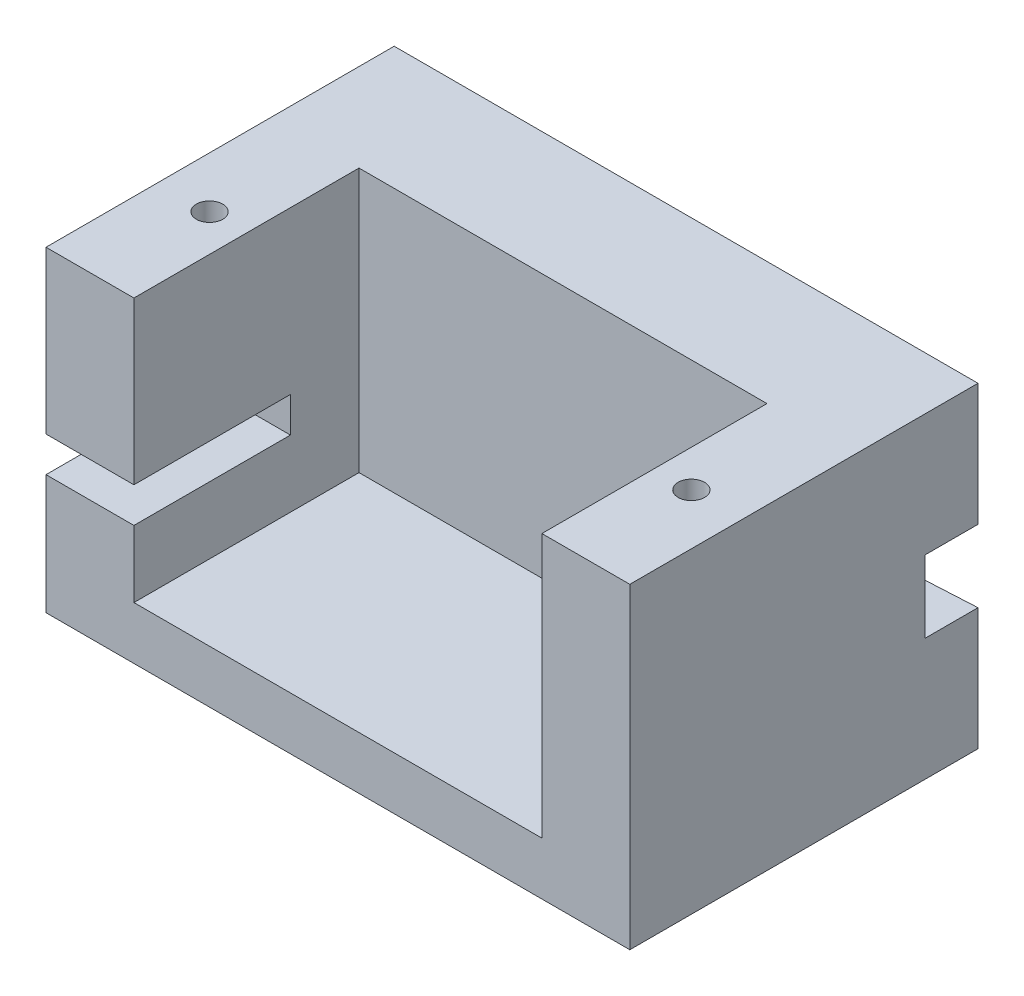
ISO-10303-21;
HEADER;
FILE_DESCRIPTION(('STEP AP214'),'2;1');
FILE_NAME('part.step','',(''),(''),'','','');
FILE_SCHEMA(('AUTOMOTIVE_DESIGN { 1 0 10303 214 1 1 1 1 }'));
ENDSEC;
DATA;
#1=APPLICATION_CONTEXT('core data for automotive mechanical design processes');
#2=APPLICATION_PROTOCOL_DEFINITION('international standard','automotive_design',2000,#1);
#3=PRODUCT_CONTEXT('',#1,'mechanical');
#4=PRODUCT('Part','Part','',(#3));
#5=PRODUCT_RELATED_PRODUCT_CATEGORY('part','',(#4));
#6=PRODUCT_DEFINITION_FORMATION('','',#4);
#7=PRODUCT_DEFINITION_CONTEXT('part definition',#1,'design');
#8=PRODUCT_DEFINITION('design','',#6,#7);
#9=PRODUCT_DEFINITION_SHAPE('','',#8);
#10=(LENGTH_UNIT() NAMED_UNIT(*) SI_UNIT(.MILLI.,.METRE.));
#11=(NAMED_UNIT(*) PLANE_ANGLE_UNIT() SI_UNIT($,.RADIAN.));
#12=(NAMED_UNIT(*) SI_UNIT($,.STERADIAN.) SOLID_ANGLE_UNIT());
#13=UNCERTAINTY_MEASURE_WITH_UNIT(LENGTH_MEASURE(1.E-05),#10,'distance_accuracy_value','');
#14=(GEOMETRIC_REPRESENTATION_CONTEXT(3) GLOBAL_UNCERTAINTY_ASSIGNED_CONTEXT((#13)) GLOBAL_UNIT_ASSIGNED_CONTEXT((#10,
#11,#12)) REPRESENTATION_CONTEXT('',''));
#15=CARTESIAN_POINT('',(0.,0.,0.));
#16=DIRECTION('',(0.,0.,1.));
#17=DIRECTION('',(1.,0.,0.));
#18=AXIS2_PLACEMENT_3D('',#15,#16,#17);
#19=CARTESIAN_POINT('',(27.9,14.7,0.3));
#20=DIRECTION('',(0.,0.,-1.));
#21=DIRECTION('',(0.,1.,0.));
#22=AXIS2_PLACEMENT_3D('',#19,#20,#21);
#23=PLANE('',#22);
#24=DIRECTION('',(0.,-1.,0.));
#25=VECTOR('',#24,1.);
#26=CARTESIAN_POINT('',(-0.3,55.275054314054,0.3));
#27=LINE('',#26,#25);
#28=CARTESIAN_POINT('',(-0.300000000000002,3.5,0.3));
#29=VERTEX_POINT('',#28);
#30=CARTESIAN_POINT('',(-0.3,-0.3,0.300000000000004));
#31=VERTEX_POINT('',#30);
#32=EDGE_CURVE('E183',#29,#31,#27,.T.);
#33=ORIENTED_EDGE('',*,*,#32,.F.);
#34=DIRECTION('',(-1.,0.,0.));
#35=VECTOR('',#34,1.);
#36=CARTESIAN_POINT('',(27.901,3.5,0.299999999999999));
#37=LINE('',#36,#35);
#38=CARTESIAN_POINT('',(-5.3,3.5,0.300000000000003));
#39=VERTEX_POINT('',#38);
#40=EDGE_CURVE('E191',#29,#39,#37,.T.);
#41=ORIENTED_EDGE('',*,*,#40,.T.);
#42=DIRECTION('',(0.,-1.,0.));
#43=VECTOR('',#42,1.);
#44=CARTESIAN_POINT('',(-5.3,14.7,0.300000000000001));
#45=LINE('',#44,#43);
#46=CARTESIAN_POINT('',(-5.3,-3.3,0.300000000000001));
#47=VERTEX_POINT('',#46);
#48=EDGE_CURVE('E423',#39,#47,#45,.T.);
#49=ORIENTED_EDGE('',*,*,#48,.T.);
#50=DIRECTION('',(-1.,0.,0.));
#51=VECTOR('',#50,1.);
#52=CARTESIAN_POINT('',(27.9,-3.3,0.300000000000005));
#53=LINE('',#52,#51);
#54=CARTESIAN_POINT('',(27.9,-3.3,0.300000000000005));
#55=VERTEX_POINT('',#54);
#56=EDGE_CURVE('E312',#55,#47,#53,.T.);
#57=ORIENTED_EDGE('',*,*,#56,.F.);
#58=DIRECTION('',(0.,-1.,0.));
#59=VECTOR('',#58,1.);
#60=CARTESIAN_POINT('',(27.9,14.7,0.3));
#61=LINE('',#60,#59);
#62=CARTESIAN_POINT('',(27.9,14.7,0.3));
#63=VERTEX_POINT('',#62);
#64=EDGE_CURVE('E418',#63,#55,#61,.T.);
#65=ORIENTED_EDGE('',*,*,#64,.F.);
#66=DIRECTION('',(-1.,0.,0.));
#67=VECTOR('',#66,1.);
#68=CARTESIAN_POINT('',(27.9,14.7,0.3));
#69=LINE('',#68,#67);
#70=CARTESIAN_POINT('',(22.9,14.7,0.3));
#71=VERTEX_POINT('',#70);
#72=EDGE_CURVE('E412',#63,#71,#69,.T.);
#73=ORIENTED_EDGE('',*,*,#72,.T.);
#74=DIRECTION('',(0.,-1.,0.));
#75=VECTOR('',#74,1.);
#76=CARTESIAN_POINT('',(22.9,55.275054314054,0.3));
#77=LINE('',#76,#75);
#78=CARTESIAN_POINT('',(22.9,-0.3,0.300000000000004));
#79=VERTEX_POINT('',#78);
#80=EDGE_CURVE('E214',#71,#79,#77,.T.);
#81=ORIENTED_EDGE('',*,*,#80,.T.);
#82=DIRECTION('',(-1.,0.,0.));
#83=VECTOR('',#82,1.);
#84=CARTESIAN_POINT('',(22.9,-0.3,0.3));
#85=LINE('',#84,#83);
#86=EDGE_CURVE('E199',#79,#31,#85,.T.);
#87=ORIENTED_EDGE('',*,*,#86,.T.);
#88=EDGE_LOOP('',(#33,#41,#49,#57,#65,#73,#81,#87));
#89=FACE_BOUND('',#88,.T.);
#90=ADVANCED_FACE('F38',(#89),#23,.F.);
#91=CARTESIAN_POINT('',(0.,0.,-19.5));
#92=DIRECTION('',(0.,0.,-1.));
#93=DIRECTION('',(-1.,0.,0.));
#94=AXIS2_PLACEMENT_3D('',#91,#92,#93);
#95=PLANE('',#94);
#96=DIRECTION('',(-0.998711997828753,0.0507380073800748,0.));
#97=VECTOR('',#96,1.);
#98=CARTESIAN_POINT('',(-1.89708740221758,3.475,-19.5));
#99=LINE('',#98,#97);
#100=CARTESIAN_POINT('',(8.9289506542461,2.925,-19.5));
#101=VERTEX_POINT('',#100);
#102=CARTESIAN_POINT('',(-5.3,3.64787967389538,-19.5));
#103=VERTEX_POINT('',#102);
#104=EDGE_CURVE('E353',#101,#103,#99,.T.);
#105=ORIENTED_EDGE('',*,*,#104,.F.);
#106=CARTESIAN_POINT('',(11.3,5.7,-19.5));
#107=DIRECTION('',(0.,0.,-1.));
#108=DIRECTION('',(-1.,0.,0.));
#109=AXIS2_PLACEMENT_3D('',#106,#107,#108);
#110=CIRCLE('',#109,3.65);
#111=CARTESIAN_POINT('',(13.6710493457539,2.925,-19.5));
#112=VERTEX_POINT('',#111);
#113=EDGE_CURVE('E356',#112,#101,#110,.T.);
#114=ORIENTED_EDGE('',*,*,#113,.F.);
#115=DIRECTION('',(-0.998711997828753,-0.0507380073800734,0.));
#116=VECTOR('',#115,1.);
#117=CARTESIAN_POINT('',(13.6710493457539,2.925,-19.5));
#118=LINE('',#117,#116);
#119=CARTESIAN_POINT('',(27.9,3.64787967389537,-19.5));
#120=VERTEX_POINT('',#119);
#121=EDGE_CURVE('E360',#120,#112,#118,.T.);
#122=ORIENTED_EDGE('',*,*,#121,.F.);
#123=DIRECTION('',(0.,-1.,0.));
#124=VECTOR('',#123,1.);
#125=CARTESIAN_POINT('',(27.9,14.7,-19.5));
#126=LINE('',#125,#124);
#127=CARTESIAN_POINT('',(27.9,-3.3,-19.5));
#128=VERTEX_POINT('',#127);
#129=EDGE_CURVE('E272',#120,#128,#126,.T.);
#130=ORIENTED_EDGE('',*,*,#129,.T.);
#131=DIRECTION('',(-1.,0.,0.));
#132=VECTOR('',#131,1.);
#133=CARTESIAN_POINT('',(27.9,-3.3,-19.5));
#134=LINE('',#133,#132);
#135=CARTESIAN_POINT('',(-5.3,-3.3,-19.5));
#136=VERTEX_POINT('',#135);
#137=EDGE_CURVE('E267',#128,#136,#134,.T.);
#138=ORIENTED_EDGE('',*,*,#137,.T.);
#139=DIRECTION('',(0.,1.,0.));
#140=VECTOR('',#139,1.);
#141=CARTESIAN_POINT('',(-5.3,-3.3,-19.5));
#142=LINE('',#141,#140);
#143=EDGE_CURVE('E266',#136,#103,#142,.T.);
#144=ORIENTED_EDGE('',*,*,#143,.T.);
#145=EDGE_LOOP('',(#105,#114,#122,#130,#138,#144));
#146=FACE_BOUND('',#145,.T.);
#147=ADVANCED_FACE('F319',(#146),#95,.T.);
#148=CARTESIAN_POINT('',(27.9,55.275054314054,-17.5));
#149=DIRECTION('',(1.,0.,0.));
#150=DIRECTION('',(0.,0.,-1.));
#151=AXIS2_PLACEMENT_3D('',#148,#149,#150);
#152=PLANE('',#151);
#153=ORIENTED_EDGE('',*,*,#64,.T.);
#154=DIRECTION('',(0.,0.,1.));
#155=VECTOR('',#154,1.);
#156=CARTESIAN_POINT('',(27.9,-3.3,-17.5));
#157=LINE('',#156,#155);
#158=EDGE_CURVE('E300',#128,#55,#157,.T.);
#159=ORIENTED_EDGE('',*,*,#158,.F.);
#160=ORIENTED_EDGE('',*,*,#129,.F.);
#161=DIRECTION('',(0.,0.,-1.));
#162=VECTOR('',#161,1.);
#163=CARTESIAN_POINT('',(27.9,3.64787967389537,-16.5));
#164=LINE('',#163,#162);
#165=CARTESIAN_POINT('',(27.9,3.64787967389537,-16.5));
#166=VERTEX_POINT('',#165);
#167=EDGE_CURVE('E337',#166,#120,#164,.T.);
#168=ORIENTED_EDGE('',*,*,#167,.F.);
#169=DIRECTION('',(0.,-1.,0.));
#170=VECTOR('',#169,1.);
#171=CARTESIAN_POINT('',(27.9,7.75212032610461,-16.5));
#172=LINE('',#171,#170);
#173=CARTESIAN_POINT('',(27.9,7.75212032610461,-16.5));
#174=VERTEX_POINT('',#173);
#175=EDGE_CURVE('E387',#174,#166,#172,.T.);
#176=ORIENTED_EDGE('',*,*,#175,.F.);
#177=DIRECTION('',(0.,0.,-1.));
#178=VECTOR('',#177,1.);
#179=CARTESIAN_POINT('',(27.9,7.75212032610461,-16.5));
#180=LINE('',#179,#178);
#181=CARTESIAN_POINT('',(27.9,7.75212032610461,-19.5));
#182=VERTEX_POINT('',#181);
#183=EDGE_CURVE('E332',#174,#182,#180,.T.);
#184=ORIENTED_EDGE('',*,*,#183,.T.);
#185=CARTESIAN_POINT('',(27.9,14.7,-19.5));
#186=VERTEX_POINT('',#185);
#187=EDGE_CURVE('E189',#186,#182,#126,.T.);
#188=ORIENTED_EDGE('',*,*,#187,.F.);
#189=DIRECTION('',(0.,0.,1.));
#190=VECTOR('',#189,1.);
#191=CARTESIAN_POINT('',(27.9,14.7,-17.5));
#192=LINE('',#191,#190);
#193=EDGE_CURVE('E238',#186,#63,#192,.T.);
#194=ORIENTED_EDGE('',*,*,#193,.T.);
#195=EDGE_LOOP('',(#153,#159,#160,#168,#176,#184,#188,#194));
#196=FACE_BOUND('',#195,.T.);
#197=ADVANCED_FACE('F445',(#196),#152,.T.);
#198=CARTESIAN_POINT('',(-5.3,55.275054314054,-17.5));
#199=DIRECTION('',(-1.,0.,0.));
#200=DIRECTION('',(0.,0.,1.));
#201=AXIS2_PLACEMENT_3D('',#198,#199,#200);
#202=PLANE('',#201);
#203=ORIENTED_EDGE('',*,*,#48,.F.);
#204=DIRECTION('',(0.,0.,1.));
#205=VECTOR('',#204,1.);
#206=CARTESIAN_POINT('',(-5.3,3.5,-8.6));
#207=LINE('',#206,#205);
#208=CARTESIAN_POINT('',(-5.3,3.5,-8.6));
#209=VERTEX_POINT('',#208);
#210=EDGE_CURVE('E56',#209,#39,#207,.T.);
#211=ORIENTED_EDGE('',*,*,#210,.F.);
#212=DIRECTION('',(0.,-1.,0.));
#213=VECTOR('',#212,1.);
#214=CARTESIAN_POINT('',(-5.3,5.5,-8.6));
#215=LINE('',#214,#213);
#216=CARTESIAN_POINT('',(-5.3,5.5,-8.6));
#217=VERTEX_POINT('',#216);
#218=EDGE_CURVE('E288',#217,#209,#215,.T.);
#219=ORIENTED_EDGE('',*,*,#218,.F.);
#220=DIRECTION('',(0.,0.,1.));
#221=VECTOR('',#220,1.);
#222=CARTESIAN_POINT('',(-5.3,5.5,-8.6));
#223=LINE('',#222,#221);
#224=CARTESIAN_POINT('',(-5.3,5.5,0.300000000000001));
#225=VERTEX_POINT('',#224);
#226=EDGE_CURVE('E281',#217,#225,#223,.T.);
#227=ORIENTED_EDGE('',*,*,#226,.T.);
#228=CARTESIAN_POINT('',(-5.3,14.7,0.300000000000001));
#229=VERTEX_POINT('',#228);
#230=EDGE_CURVE('E251',#229,#225,#45,.T.);
#231=ORIENTED_EDGE('',*,*,#230,.F.);
#232=DIRECTION('',(0.,0.,-1.));
#233=VECTOR('',#232,1.);
#234=CARTESIAN_POINT('',(-5.3,14.7,-17.5));
#235=LINE('',#234,#233);
#236=CARTESIAN_POINT('',(-5.3,14.7,-19.5));
#237=VERTEX_POINT('',#236);
#238=EDGE_CURVE('E216',#229,#237,#235,.T.);
#239=ORIENTED_EDGE('',*,*,#238,.T.);
#240=CARTESIAN_POINT('',(-5.3,7.75212032610462,-19.5));
#241=VERTEX_POINT('',#240);
#242=EDGE_CURVE('E249',#241,#237,#142,.T.);
#243=ORIENTED_EDGE('',*,*,#242,.F.);
#244=DIRECTION('',(0.,0.,-1.));
#245=VECTOR('',#244,1.);
#246=CARTESIAN_POINT('',(-5.3,7.75212032610462,-16.5));
#247=LINE('',#246,#245);
#248=CARTESIAN_POINT('',(-5.3,7.75212032610462,-16.5));
#249=VERTEX_POINT('',#248);
#250=EDGE_CURVE('E325',#249,#241,#247,.T.);
#251=ORIENTED_EDGE('',*,*,#250,.F.);
#252=DIRECTION('',(0.,1.,0.));
#253=VECTOR('',#252,1.);
#254=CARTESIAN_POINT('',(-5.3,7.75212032610462,-16.5));
#255=LINE('',#254,#253);
#256=CARTESIAN_POINT('',(-5.3,3.64787967389538,-16.5));
#257=VERTEX_POINT('',#256);
#258=EDGE_CURVE('E373',#257,#249,#255,.T.);
#259=ORIENTED_EDGE('',*,*,#258,.F.);
#260=DIRECTION('',(0.,0.,-1.));
#261=VECTOR('',#260,1.);
#262=CARTESIAN_POINT('',(-5.3,3.64787967389538,-16.5));
#263=LINE('',#262,#261);
#264=EDGE_CURVE('E316',#257,#103,#263,.T.);
#265=ORIENTED_EDGE('',*,*,#264,.T.);
#266=ORIENTED_EDGE('',*,*,#143,.F.);
#267=DIRECTION('',(0.,0.,-1.));
#268=VECTOR('',#267,1.);
#269=CARTESIAN_POINT('',(-5.3,-3.3,5.3));
#270=LINE('',#269,#268);
#271=EDGE_CURVE('E229',#47,#136,#270,.T.);
#272=ORIENTED_EDGE('',*,*,#271,.F.);
#273=EDGE_LOOP('',(#203,#211,#219,#227,#231,#239,#243,#251,#259,#265,#266,#272));
#274=FACE_BOUND('',#273,.T.);
#275=ADVANCED_FACE('F247',(#274),#202,.T.);
#276=CARTESIAN_POINT('',(22.9,55.275054314054,-12.5));
#277=DIRECTION('',(1.,0.,0.));
#278=DIRECTION('',(0.,0.,-1.));
#279=AXIS2_PLACEMENT_3D('',#276,#277,#278);
#280=PLANE('',#279);
#281=DIRECTION('',(0.,0.,1.));
#282=VECTOR('',#281,1.);
#283=CARTESIAN_POINT('',(22.9,14.7,-12.5));
#284=LINE('',#283,#282);
#285=CARTESIAN_POINT('',(22.9,14.7,-12.5));
#286=VERTEX_POINT('',#285);
#287=EDGE_CURVE('E234',#286,#71,#284,.T.);
#288=ORIENTED_EDGE('',*,*,#287,.F.);
#289=DIRECTION('',(0.,-1.,0.));
#290=VECTOR('',#289,1.);
#291=CARTESIAN_POINT('',(22.9,55.275054314054,-12.5));
#292=LINE('',#291,#290);
#293=CARTESIAN_POINT('',(22.9,-0.3,-12.5));
#294=VERTEX_POINT('',#293);
#295=EDGE_CURVE('E217',#286,#294,#292,.T.);
#296=ORIENTED_EDGE('',*,*,#295,.T.);
#297=DIRECTION('',(0.,0.,1.));
#298=VECTOR('',#297,1.);
#299=CARTESIAN_POINT('',(22.9,-0.3,-12.5));
#300=LINE('',#299,#298);
#301=EDGE_CURVE('E220',#294,#79,#300,.T.);
#302=ORIENTED_EDGE('',*,*,#301,.T.);
#303=ORIENTED_EDGE('',*,*,#80,.F.);
#304=EDGE_LOOP('',(#288,#296,#302,#303));
#305=FACE_BOUND('',#304,.T.);
#306=ADVANCED_FACE('F466',(#305),#280,.F.);
#307=CARTESIAN_POINT('',(22.9,55.275054314054,-12.5));
#308=DIRECTION('',(0.,0.,-1.));
#309=DIRECTION('',(-1.,0.,0.));
#310=AXIS2_PLACEMENT_3D('',#307,#308,#309);
#311=PLANE('',#310);
#312=DIRECTION('',(1.,0.,0.));
#313=VECTOR('',#312,1.);
#314=CARTESIAN_POINT('',(22.9,14.7,-12.5));
#315=LINE('',#314,#313);
#316=CARTESIAN_POINT('',(-0.3,14.7,-12.5));
#317=VERTEX_POINT('',#316);
#318=EDGE_CURVE('E11',#317,#286,#315,.T.);
#319=ORIENTED_EDGE('',*,*,#318,.F.);
#320=DIRECTION('',(0.,-1.,0.));
#321=VECTOR('',#320,1.);
#322=CARTESIAN_POINT('',(-0.3,55.275054314054,-12.5));
#323=LINE('',#322,#321);
#324=CARTESIAN_POINT('',(-0.3,-0.3,-12.5));
#325=VERTEX_POINT('',#324);
#326=EDGE_CURVE('E42',#317,#325,#323,.T.);
#327=ORIENTED_EDGE('',*,*,#326,.T.);
#328=DIRECTION('',(1.,0.,0.));
#329=VECTOR('',#328,1.);
#330=CARTESIAN_POINT('',(22.9,-0.3,-12.5));
#331=LINE('',#330,#329);
#332=EDGE_CURVE('E203',#325,#294,#331,.T.);
#333=ORIENTED_EDGE('',*,*,#332,.T.);
#334=ORIENTED_EDGE('',*,*,#295,.F.);
#335=EDGE_LOOP('',(#319,#327,#333,#334));
#336=FACE_BOUND('',#335,.T.);
#337=ADVANCED_FACE('F464',(#336),#311,.F.);
#338=CARTESIAN_POINT('',(-0.3,55.275054314054,-12.5));
#339=DIRECTION('',(-1.,0.,0.));
#340=DIRECTION('',(0.,0.,1.));
#341=AXIS2_PLACEMENT_3D('',#338,#339,#340);
#342=PLANE('',#341);
#343=DIRECTION('',(0.,0.,-1.));
#344=VECTOR('',#343,1.);
#345=CARTESIAN_POINT('',(-0.300000000000002,3.5,-8.6));
#346=LINE('',#345,#344);
#347=CARTESIAN_POINT('',(-0.3,3.5,-8.6));
#348=VERTEX_POINT('',#347);
#349=EDGE_CURVE('E179',#29,#348,#346,.T.);
#350=ORIENTED_EDGE('',*,*,#349,.F.);
#351=ORIENTED_EDGE('',*,*,#32,.T.);
#352=DIRECTION('',(0.,0.,-1.));
#353=VECTOR('',#352,1.);
#354=CARTESIAN_POINT('',(-0.3,-0.3,-12.5));
#355=LINE('',#354,#353);
#356=EDGE_CURVE('E208',#31,#325,#355,.T.);
#357=ORIENTED_EDGE('',*,*,#356,.T.);
#358=ORIENTED_EDGE('',*,*,#326,.F.);
#359=DIRECTION('',(0.,0.,-1.));
#360=VECTOR('',#359,1.);
#361=CARTESIAN_POINT('',(-0.3,14.7,-12.5));
#362=LINE('',#361,#360);
#363=CARTESIAN_POINT('',(-0.300000000000002,14.7,0.3));
#364=VERTEX_POINT('',#363);
#365=EDGE_CURVE('E48',#364,#317,#362,.T.);
#366=ORIENTED_EDGE('',*,*,#365,.F.);
#367=CARTESIAN_POINT('',(-0.3,5.50000000000001,0.3));
#368=VERTEX_POINT('',#367);
#369=EDGE_CURVE('E202',#364,#368,#27,.T.);
#370=ORIENTED_EDGE('',*,*,#369,.T.);
#371=DIRECTION('',(0.,0.,-1.));
#372=VECTOR('',#371,1.);
#373=CARTESIAN_POINT('',(-0.300000000000002,5.5,-8.6));
#374=LINE('',#373,#372);
#375=CARTESIAN_POINT('',(-0.300000000000002,5.5,-8.6));
#376=VERTEX_POINT('',#375);
#377=EDGE_CURVE('E64',#368,#376,#374,.T.);
#378=ORIENTED_EDGE('',*,*,#377,.T.);
#379=DIRECTION('',(0.,1.,0.));
#380=VECTOR('',#379,1.);
#381=CARTESIAN_POINT('',(-0.300000000000002,5.5,-8.6));
#382=LINE('',#381,#380);
#383=EDGE_CURVE('E186',#348,#376,#382,.T.);
#384=ORIENTED_EDGE('',*,*,#383,.F.);
#385=EDGE_LOOP('',(#350,#351,#357,#358,#366,#370,#378,#384));
#386=FACE_BOUND('',#385,.T.);
#387=ADVANCED_FACE('F180',(#386),#342,.F.);
#388=CARTESIAN_POINT('',(0.,14.7,0.));
#389=DIRECTION('',(0.,1.,0.));
#390=DIRECTION('',(0.,0.,1.));
#391=AXIS2_PLACEMENT_3D('',#388,#389,#390);
#392=PLANE('',#391);
#393=ORIENTED_EDGE('',*,*,#72,.F.);
#394=ORIENTED_EDGE('',*,*,#193,.F.);
#395=DIRECTION('',(1.,0.,0.));
#396=VECTOR('',#395,1.);
#397=CARTESIAN_POINT('',(-5.3,14.7,-19.5));
#398=LINE('',#397,#396);
#399=EDGE_CURVE('E260',#237,#186,#398,.T.);
#400=ORIENTED_EDGE('',*,*,#399,.F.);
#401=ORIENTED_EDGE('',*,*,#238,.F.);
#402=EDGE_CURVE('E415',#364,#229,#69,.T.);
#403=ORIENTED_EDGE('',*,*,#402,.F.);
#404=ORIENTED_EDGE('',*,*,#365,.T.);
#405=ORIENTED_EDGE('',*,*,#318,.T.);
#406=ORIENTED_EDGE('',*,*,#287,.T.);
#407=EDGE_LOOP('',(#393,#394,#400,#401,#403,#404,#405,#406));
#408=FACE_BOUND('',#407,.T.);
#409=CARTESIAN_POINT('',(-2.4,14.7,-6.1));
#410=DIRECTION('',(0.,1.,0.));
#411=DIRECTION('',(0.,0.,1.));
#412=AXIS2_PLACEMENT_3D('',#409,#410,#411);
#413=CIRCLE('',#412,0.75);
#414=CARTESIAN_POINT('',(-2.4,14.7,-5.35));
#415=VERTEX_POINT('',#414);
#416=EDGE_CURVE('E405',#415,#415,#413,.T.);
#417=ORIENTED_EDGE('',*,*,#416,.F.);
#418=EDGE_LOOP('',(#417));
#419=FACE_BOUND('',#418,.T.);
#420=CARTESIAN_POINT('',(25.,14.7,-6.1));
#421=DIRECTION('',(0.,1.,0.));
#422=DIRECTION('',(0.,0.,1.));
#423=AXIS2_PLACEMENT_3D('',#420,#421,#422);
#424=CIRCLE('',#423,0.750000000000002);
#425=CARTESIAN_POINT('',(25.,14.7,-5.35));
#426=VERTEX_POINT('',#425);
#427=EDGE_CURVE('E397',#426,#426,#424,.T.);
#428=ORIENTED_EDGE('',*,*,#427,.F.);
#429=EDGE_LOOP('',(#428));
#430=FACE_BOUND('',#429,.T.);
#431=ADVANCED_FACE('F40',(#408,#419,#430),#392,.T.);
#432=CARTESIAN_POINT('',(0.,-0.3,0.));
#433=DIRECTION('',(0.,-1.,0.));
#434=DIRECTION('',(0.,0.,-1.));
#435=AXIS2_PLACEMENT_3D('',#432,#433,#434);
#436=PLANE('',#435);
#437=ORIENTED_EDGE('',*,*,#86,.F.);
#438=ORIENTED_EDGE('',*,*,#301,.F.);
#439=ORIENTED_EDGE('',*,*,#332,.F.);
#440=ORIENTED_EDGE('',*,*,#356,.F.);
#441=EDGE_LOOP('',(#437,#438,#439,#440));
#442=FACE_BOUND('',#441,.T.);
#443=ADVANCED_FACE('F468',(#442),#436,.F.);
#444=CARTESIAN_POINT('',(0.,-3.3,0.));
#445=DIRECTION('',(0.,-1.,0.));
#446=DIRECTION('',(0.,0.,-1.));
#447=AXIS2_PLACEMENT_3D('',#444,#445,#446);
#448=PLANE('',#447);
#449=ORIENTED_EDGE('',*,*,#56,.T.);
#450=ORIENTED_EDGE('',*,*,#271,.T.);
#451=ORIENTED_EDGE('',*,*,#137,.F.);
#452=ORIENTED_EDGE('',*,*,#158,.T.);
#453=EDGE_LOOP('',(#449,#450,#451,#452));
#454=FACE_BOUND('',#453,.T.);
#455=ADVANCED_FACE('F310',(#454),#448,.T.);
#456=CARTESIAN_POINT('',(27.901,3.5,-8.6));
#457=DIRECTION('',(0.,-1.,0.));
#458=DIRECTION('',(0.,0.,-1.));
#459=AXIS2_PLACEMENT_3D('',#456,#457,#458);
#460=PLANE('',#459);
#461=ORIENTED_EDGE('',*,*,#349,.T.);
#462=DIRECTION('',(-1.,0.,0.));
#463=VECTOR('',#462,1.);
#464=CARTESIAN_POINT('',(27.901,3.5,-8.6));
#465=LINE('',#464,#463);
#466=EDGE_CURVE('E284',#348,#209,#465,.T.);
#467=ORIENTED_EDGE('',*,*,#466,.T.);
#468=ORIENTED_EDGE('',*,*,#210,.T.);
#469=ORIENTED_EDGE('',*,*,#40,.F.);
#470=EDGE_LOOP('',(#461,#467,#468,#469));
#471=FACE_BOUND('',#470,.T.);
#472=ADVANCED_FACE('F192',(#471),#460,.F.);
#473=CARTESIAN_POINT('',(27.901,5.5,-8.6));
#474=DIRECTION('',(0.,-1.,0.));
#475=DIRECTION('',(0.,0.,-1.));
#476=AXIS2_PLACEMENT_3D('',#473,#474,#475);
#477=PLANE('',#476);
#478=ORIENTED_EDGE('',*,*,#377,.F.);
#479=DIRECTION('',(-1.,0.,0.));
#480=VECTOR('',#479,1.);
#481=CARTESIAN_POINT('',(27.901,5.5,0.299999999999999));
#482=LINE('',#481,#480);
#483=EDGE_CURVE('E196',#368,#225,#482,.T.);
#484=ORIENTED_EDGE('',*,*,#483,.T.);
#485=ORIENTED_EDGE('',*,*,#226,.F.);
#486=DIRECTION('',(-1.,0.,0.));
#487=VECTOR('',#486,1.);
#488=CARTESIAN_POINT('',(27.901,5.5,-8.6));
#489=LINE('',#488,#487);
#490=EDGE_CURVE('E285',#376,#217,#489,.T.);
#491=ORIENTED_EDGE('',*,*,#490,.F.);
#492=EDGE_LOOP('',(#478,#484,#485,#491));
#493=FACE_BOUND('',#492,.T.);
#494=ADVANCED_FACE('F430',(#493),#477,.T.);
#495=CARTESIAN_POINT('',(27.901,5.5,-8.6));
#496=DIRECTION('',(0.,0.,-1.));
#497=DIRECTION('',(-1.,0.,0.));
#498=AXIS2_PLACEMENT_3D('',#495,#496,#497);
#499=PLANE('',#498);
#500=ORIENTED_EDGE('',*,*,#383,.T.);
#501=ORIENTED_EDGE('',*,*,#490,.T.);
#502=ORIENTED_EDGE('',*,*,#218,.T.);
#503=ORIENTED_EDGE('',*,*,#466,.F.);
#504=EDGE_LOOP('',(#500,#501,#502,#503));
#505=FACE_BOUND('',#504,.T.);
#506=ADVANCED_FACE('F429',(#505),#499,.F.);
#507=DIRECTION('',(0.998711997828753,0.0507380073800737,0.));
#508=VECTOR('',#507,1.);
#509=CARTESIAN_POINT('',(8.9289506542461,8.47499999999999,-19.5));
#510=LINE('',#509,#508);
#511=CARTESIAN_POINT('',(8.9289506542461,8.47499999999999,-19.5));
#512=VERTEX_POINT('',#511);
#513=EDGE_CURVE('E264',#241,#512,#510,.T.);
#514=ORIENTED_EDGE('',*,*,#513,.F.);
#515=ORIENTED_EDGE('',*,*,#242,.T.);
#516=ORIENTED_EDGE('',*,*,#399,.T.);
#517=ORIENTED_EDGE('',*,*,#187,.T.);
#518=DIRECTION('',(0.998711997828753,-0.0507380073800752,0.));
#519=VECTOR('',#518,1.);
#520=CARTESIAN_POINT('',(24.4970874022176,7.92499999999999,-19.5));
#521=LINE('',#520,#519);
#522=CARTESIAN_POINT('',(13.6710493457539,8.475,-19.5));
#523=VERTEX_POINT('',#522);
#524=EDGE_CURVE('E364',#523,#182,#521,.T.);
#525=ORIENTED_EDGE('',*,*,#524,.F.);
#526=CARTESIAN_POINT('',(11.3,5.7,-19.5));
#527=DIRECTION('',(0.,0.,-1.));
#528=DIRECTION('',(-1.,0.,0.));
#529=AXIS2_PLACEMENT_3D('',#526,#527,#528);
#530=CIRCLE('',#529,3.65);
#531=EDGE_CURVE('E367',#512,#523,#530,.T.);
#532=ORIENTED_EDGE('',*,*,#531,.F.);
#533=EDGE_LOOP('',(#514,#515,#516,#517,#525,#532));
#534=FACE_BOUND('',#533,.T.);
#535=ADVANCED_FACE('F258',(#534),#95,.T.);
#536=CARTESIAN_POINT('',(11.3,5.7,-16.5));
#537=DIRECTION('',(0.,0.,-1.));
#538=DIRECTION('',(-1.,0.,0.));
#539=AXIS2_PLACEMENT_3D('',#536,#537,#538);
#540=CYLINDRICAL_SURFACE('',#539,3.65);
#541=ORIENTED_EDGE('',*,*,#531,.T.);
#542=DIRECTION('',(0.,0.,-1.));
#543=VECTOR('',#542,1.);
#544=CARTESIAN_POINT('',(13.6710493457539,8.47499999999999,-16.5));
#545=LINE('',#544,#543);
#546=CARTESIAN_POINT('',(13.6710493457539,8.47499999999999,-16.5));
#547=VERTEX_POINT('',#546);
#548=EDGE_CURVE('E328',#547,#523,#545,.T.);
#549=ORIENTED_EDGE('',*,*,#548,.F.);
#550=CARTESIAN_POINT('',(11.3,5.7,-16.5));
#551=DIRECTION('',(0.,0.,-1.));
#552=DIRECTION('',(-1.,0.,0.));
#553=AXIS2_PLACEMENT_3D('',#550,#551,#552);
#554=CIRCLE('',#553,3.65);
#555=CARTESIAN_POINT('',(8.9289506542461,8.47499999999999,-16.5));
#556=VERTEX_POINT('',#555);
#557=EDGE_CURVE('E352',#556,#547,#554,.T.);
#558=ORIENTED_EDGE('',*,*,#557,.F.);
#559=DIRECTION('',(0.,0.,-1.));
#560=VECTOR('',#559,1.);
#561=CARTESIAN_POINT('',(8.9289506542461,8.47499999999999,-16.5));
#562=LINE('',#561,#560);
#563=EDGE_CURVE('E323',#556,#512,#562,.T.);
#564=ORIENTED_EDGE('',*,*,#563,.T.);
#565=EDGE_LOOP('',(#541,#549,#558,#564));
#566=FACE_BOUND('',#565,.T.);
#567=ADVANCED_FACE('F555',(#566),#540,.F.);
#568=CARTESIAN_POINT('',(8.9289506542461,8.47499999999999,-16.5));
#569=DIRECTION('',(-0.0507380073800736,0.998711997828753,0.));
#570=DIRECTION('',(-0.998711997828753,-0.0507380073800737,0.));
#571=AXIS2_PLACEMENT_3D('',#568,#569,#570);
#572=PLANE('',#571);
#573=ORIENTED_EDGE('',*,*,#513,.T.);
#574=ORIENTED_EDGE('',*,*,#563,.F.);
#575=DIRECTION('',(0.998711997828753,0.0507380073800748,0.));
#576=VECTOR('',#575,1.);
#577=CARTESIAN_POINT('',(-1.89708740221758,7.92499999999999,-16.5));
#578=LINE('',#577,#576);
#579=EDGE_CURVE('E333',#249,#556,#578,.T.);
#580=ORIENTED_EDGE('',*,*,#579,.F.);
#581=ORIENTED_EDGE('',*,*,#250,.T.);
#582=EDGE_LOOP('',(#573,#574,#580,#581));
#583=FACE_BOUND('',#582,.T.);
#584=ADVANCED_FACE('F563',(#583),#572,.F.);
#585=CARTESIAN_POINT('',(-1.89708740221758,3.475,-16.5));
#586=DIRECTION('',(-0.0507380073800748,-0.998711997828753,0.));
#587=DIRECTION('',(0.998711997828753,-0.0507380073800748,0.));
#588=AXIS2_PLACEMENT_3D('',#585,#586,#587);
#589=PLANE('',#588);
#590=ORIENTED_EDGE('',*,*,#104,.T.);
#591=ORIENTED_EDGE('',*,*,#264,.F.);
#592=DIRECTION('',(-0.998711997828753,0.0507380073800737,0.));
#593=VECTOR('',#592,1.);
#594=CARTESIAN_POINT('',(8.9289506542461,2.925,-16.5));
#595=LINE('',#594,#593);
#596=CARTESIAN_POINT('',(8.9289506542461,2.925,-16.5));
#597=VERTEX_POINT('',#596);
#598=EDGE_CURVE('E377',#597,#257,#595,.T.);
#599=ORIENTED_EDGE('',*,*,#598,.F.);
#600=DIRECTION('',(0.,0.,-1.));
#601=VECTOR('',#600,1.);
#602=CARTESIAN_POINT('',(8.9289506542461,2.925,-16.5));
#603=LINE('',#602,#601);
#604=EDGE_CURVE('E343',#597,#101,#603,.T.);
#605=ORIENTED_EDGE('',*,*,#604,.T.);
#606=EDGE_LOOP('',(#590,#591,#599,#605));
#607=FACE_BOUND('',#606,.T.);
#608=ADVANCED_FACE('F573',(#607),#589,.F.);
#609=CARTESIAN_POINT('',(11.3,5.7,-16.5));
#610=DIRECTION('',(0.,0.,-1.));
#611=DIRECTION('',(-1.,0.,0.));
#612=AXIS2_PLACEMENT_3D('',#609,#610,#611);
#613=CYLINDRICAL_SURFACE('',#612,3.65);
#614=ORIENTED_EDGE('',*,*,#113,.T.);
#615=ORIENTED_EDGE('',*,*,#604,.F.);
#616=CARTESIAN_POINT('',(11.3,5.7,-16.5));
#617=DIRECTION('',(0.,0.,-1.));
#618=DIRECTION('',(-1.,0.,0.));
#619=AXIS2_PLACEMENT_3D('',#616,#617,#618);
#620=CIRCLE('',#619,3.65);
#621=CARTESIAN_POINT('',(13.6710493457539,2.925,-16.5));
#622=VERTEX_POINT('',#621);
#623=EDGE_CURVE('E380',#622,#597,#620,.T.);
#624=ORIENTED_EDGE('',*,*,#623,.F.);
#625=DIRECTION('',(0.,0.,-1.));
#626=VECTOR('',#625,1.);
#627=CARTESIAN_POINT('',(13.6710493457539,2.925,-16.5));
#628=LINE('',#627,#626);
#629=EDGE_CURVE('E340',#622,#112,#628,.T.);
#630=ORIENTED_EDGE('',*,*,#629,.T.);
#631=EDGE_LOOP('',(#614,#615,#624,#630));
#632=FACE_BOUND('',#631,.T.);
#633=ADVANCED_FACE('F586',(#632),#613,.F.);
#634=CARTESIAN_POINT('',(13.6710493457539,2.925,-16.5));
#635=DIRECTION('',(0.0507380073800734,-0.998711997828753,0.));
#636=DIRECTION('',(0.998711997828753,0.0507380073800734,0.));
#637=AXIS2_PLACEMENT_3D('',#634,#635,#636);
#638=PLANE('',#637);
#639=ORIENTED_EDGE('',*,*,#121,.T.);
#640=ORIENTED_EDGE('',*,*,#629,.F.);
#641=DIRECTION('',(-0.998711997828753,-0.0507380073800738,0.));
#642=VECTOR('',#641,1.);
#643=CARTESIAN_POINT('',(24.4970874022176,3.475,-16.5));
#644=LINE('',#643,#642);
#645=EDGE_CURVE('E384',#166,#622,#644,.T.);
#646=ORIENTED_EDGE('',*,*,#645,.F.);
#647=ORIENTED_EDGE('',*,*,#167,.T.);
#648=EDGE_LOOP('',(#639,#640,#646,#647));
#649=FACE_BOUND('',#648,.T.);
#650=ADVANCED_FACE('F599',(#649),#638,.F.);
#651=CARTESIAN_POINT('',(24.4970874022176,7.92499999999999,-16.5));
#652=DIRECTION('',(0.0507380073800752,0.998711997828753,0.));
#653=DIRECTION('',(-0.998711997828753,0.0507380073800752,0.));
#654=AXIS2_PLACEMENT_3D('',#651,#652,#653);
#655=PLANE('',#654);
#656=ORIENTED_EDGE('',*,*,#524,.T.);
#657=ORIENTED_EDGE('',*,*,#183,.F.);
#658=DIRECTION('',(0.998711997828753,-0.050738007380074,0.));
#659=VECTOR('',#658,1.);
#660=CARTESIAN_POINT('',(13.6710493457539,8.47499999999999,-16.5));
#661=LINE('',#660,#659);
#662=EDGE_CURVE('E391',#547,#174,#661,.T.);
#663=ORIENTED_EDGE('',*,*,#662,.F.);
#664=ORIENTED_EDGE('',*,*,#548,.T.);
#665=EDGE_LOOP('',(#656,#657,#663,#664));
#666=FACE_BOUND('',#665,.T.);
#667=ADVANCED_FACE('F609',(#666),#655,.F.);
#668=CARTESIAN_POINT('',(11.3,5.7,-16.5));
#669=DIRECTION('',(0.,0.,-1.));
#670=DIRECTION('',(-1.,0.,0.));
#671=AXIS2_PLACEMENT_3D('',#668,#669,#670);
#672=PLANE('',#671);
#673=ORIENTED_EDGE('',*,*,#557,.T.);
#674=ORIENTED_EDGE('',*,*,#662,.T.);
#675=ORIENTED_EDGE('',*,*,#175,.T.);
#676=ORIENTED_EDGE('',*,*,#645,.T.);
#677=ORIENTED_EDGE('',*,*,#623,.T.);
#678=ORIENTED_EDGE('',*,*,#598,.T.);
#679=ORIENTED_EDGE('',*,*,#258,.T.);
#680=ORIENTED_EDGE('',*,*,#579,.T.);
#681=EDGE_LOOP('',(#673,#674,#675,#676,#677,#678,#679,#680));
#682=FACE_BOUND('',#681,.T.);
#683=ADVANCED_FACE('F622',(#682),#672,.T.);
#684=CARTESIAN_POINT('',(25.,6.7,-6.1));
#685=DIRECTION('',(0.,1.,0.));
#686=DIRECTION('',(0.,0.,1.));
#687=AXIS2_PLACEMENT_3D('',#684,#685,#686);
#688=CYLINDRICAL_SURFACE('',#687,0.750000000000002);
#689=CARTESIAN_POINT('',(25.,6.7,-6.1));
#690=DIRECTION('',(0.,1.,0.));
#691=DIRECTION('',(0.,0.,1.));
#692=AXIS2_PLACEMENT_3D('',#689,#690,#691);
#693=CIRCLE('',#692,0.750000000000002);
#694=CARTESIAN_POINT('',(25.,6.7,-5.35));
#695=VERTEX_POINT('',#694);
#696=EDGE_CURVE('E401',#695,#695,#693,.T.);
#697=ORIENTED_EDGE('',*,*,#696,.F.);
#698=EDGE_LOOP('',(#697));
#699=FACE_BOUND('',#698,.T.);
#700=ORIENTED_EDGE('',*,*,#427,.T.);
#701=EDGE_LOOP('',(#700));
#702=FACE_BOUND('',#701,.T.);
#703=ADVANCED_FACE('F635',(#699,#702),#688,.F.);
#704=CARTESIAN_POINT('',(25.,6.7,-6.1));
#705=DIRECTION('',(0.,1.,0.));
#706=DIRECTION('',(0.,0.,1.));
#707=AXIS2_PLACEMENT_3D('',#704,#705,#706);
#708=PLANE('',#707);
#709=ORIENTED_EDGE('',*,*,#696,.T.);
#710=EDGE_LOOP('',(#709));
#711=FACE_BOUND('',#710,.T.);
#712=ADVANCED_FACE('F645',(#711),#708,.T.);
#713=CARTESIAN_POINT('',(-2.4,6.7,-6.1));
#714=DIRECTION('',(0.,1.,0.));
#715=DIRECTION('',(0.,0.,1.));
#716=AXIS2_PLACEMENT_3D('',#713,#714,#715);
#717=CYLINDRICAL_SURFACE('',#716,0.75);
#718=CARTESIAN_POINT('',(-2.4,6.7,-6.1));
#719=DIRECTION('',(0.,1.,0.));
#720=DIRECTION('',(0.,0.,1.));
#721=AXIS2_PLACEMENT_3D('',#718,#719,#720);
#722=CIRCLE('',#721,0.75);
#723=CARTESIAN_POINT('',(-2.4,6.7,-5.35));
#724=VERTEX_POINT('',#723);
#725=EDGE_CURVE('E370',#724,#724,#722,.T.);
#726=ORIENTED_EDGE('',*,*,#725,.F.);
#727=EDGE_LOOP('',(#726));
#728=FACE_BOUND('',#727,.T.);
#729=ORIENTED_EDGE('',*,*,#416,.T.);
#730=EDGE_LOOP('',(#729));
#731=FACE_BOUND('',#730,.T.);
#732=ADVANCED_FACE('F454',(#728,#731),#717,.F.);
#733=CARTESIAN_POINT('',(-2.4,6.7,-6.1));
#734=DIRECTION('',(0.,1.,0.));
#735=DIRECTION('',(0.,0.,1.));
#736=AXIS2_PLACEMENT_3D('',#733,#734,#735);
#737=PLANE('',#736);
#738=ORIENTED_EDGE('',*,*,#725,.T.);
#739=EDGE_LOOP('',(#738));
#740=FACE_BOUND('',#739,.T.);
#741=ADVANCED_FACE('F449',(#740),#737,.T.);
#742=ORIENTED_EDGE('',*,*,#230,.T.);
#743=ORIENTED_EDGE('',*,*,#483,.F.);
#744=ORIENTED_EDGE('',*,*,#369,.F.);
#745=ORIENTED_EDGE('',*,*,#402,.T.);
#746=EDGE_LOOP('',(#742,#743,#744,#745));
#747=FACE_BOUND('',#746,.T.);
#748=ADVANCED_FACE('F441',(#747),#23,.F.);
#749=CLOSED_SHELL('',(#90,#147,#197,#275,#306,#337,#387,#431,#443,#455,#472,#494,#506,#535,#567,
#584,#608,#633,#650,#667,#683,#703,#712,#732,#741,#748));
#750=MANIFOLD_SOLID_BREP('B2',#749);
#751=ADVANCED_BREP_SHAPE_REPRESENTATION('',(#18,#750),#14);
#752=SHAPE_DEFINITION_REPRESENTATION(#9,#751);
ENDSEC;
END-ISO-10303-21;
